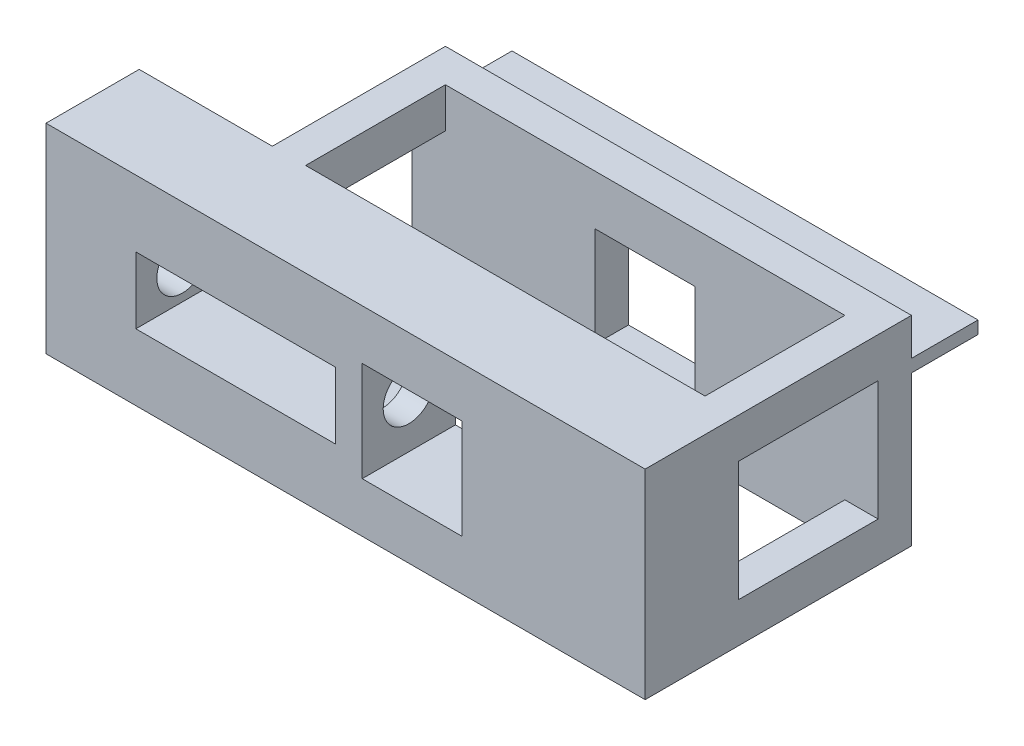
ISO-10303-21;
HEADER;
FILE_DESCRIPTION(('STEP AP214'),'2;1');
FILE_NAME('part.step','',(''),(''),'','','');
FILE_SCHEMA(('AUTOMOTIVE_DESIGN { 1 0 10303 214 1 1 1 1 }'));
ENDSEC;
DATA;
#1=APPLICATION_CONTEXT('core data for automotive mechanical design processes');
#2=APPLICATION_PROTOCOL_DEFINITION('international standard','automotive_design',2000,#1);
#3=PRODUCT_CONTEXT('',#1,'mechanical');
#4=PRODUCT('Part','Part','',(#3));
#5=PRODUCT_RELATED_PRODUCT_CATEGORY('part','',(#4));
#6=PRODUCT_DEFINITION_FORMATION('','',#4);
#7=PRODUCT_DEFINITION_CONTEXT('part definition',#1,'design');
#8=PRODUCT_DEFINITION('design','',#6,#7);
#9=PRODUCT_DEFINITION_SHAPE('','',#8);
#10=(LENGTH_UNIT() NAMED_UNIT(*) SI_UNIT(.MILLI.,.METRE.));
#11=(NAMED_UNIT(*) PLANE_ANGLE_UNIT() SI_UNIT($,.RADIAN.));
#12=(NAMED_UNIT(*) SI_UNIT($,.STERADIAN.) SOLID_ANGLE_UNIT());
#13=UNCERTAINTY_MEASURE_WITH_UNIT(LENGTH_MEASURE(1.E-05),#10,'distance_accuracy_value','');
#14=(GEOMETRIC_REPRESENTATION_CONTEXT(3) GLOBAL_UNCERTAINTY_ASSIGNED_CONTEXT((#13)) GLOBAL_UNIT_ASSIGNED_CONTEXT((#10,
#11,#12)) REPRESENTATION_CONTEXT('',''));
#15=CARTESIAN_POINT('',(0.,0.,0.));
#16=DIRECTION('',(0.,0.,1.));
#17=DIRECTION('',(1.,0.,0.));
#18=AXIS2_PLACEMENT_3D('',#15,#16,#17);
#19=CARTESIAN_POINT('',(0.,0.,-50.8));
#20=DIRECTION('',(0.,0.,1.));
#21=DIRECTION('',(1.,0.,0.));
#22=AXIS2_PLACEMENT_3D('',#19,#20,#21);
#23=PLANE('',#22);
#24=DIRECTION('',(1.,0.,0.));
#25=VECTOR('',#24,1.);
#26=CARTESIAN_POINT('',(88.9,30.988,-50.8));
#27=LINE('',#26,#25);
#28=CARTESIAN_POINT('',(0.,30.988,-50.8));
#29=VERTEX_POINT('',#28);
#30=CARTESIAN_POINT('',(88.9,30.988,-50.8));
#31=VERTEX_POINT('',#30);
#32=EDGE_CURVE('E56',#29,#31,#27,.T.);
#33=ORIENTED_EDGE('',*,*,#32,.F.);
#34=DIRECTION('',(0.,1.,0.));
#35=VECTOR('',#34,1.);
#36=CARTESIAN_POINT('',(0.,0.,-50.8));
#37=LINE('',#36,#35);
#38=CARTESIAN_POINT('',(0.,38.1,-50.8));
#39=VERTEX_POINT('',#38);
#40=EDGE_CURVE('E517',#29,#39,#37,.T.);
#41=ORIENTED_EDGE('',*,*,#40,.T.);
#42=DIRECTION('',(-1.,0.,0.));
#43=VECTOR('',#42,1.);
#44=CARTESIAN_POINT('',(0.,38.1,-50.8));
#45=LINE('',#44,#43);
#46=CARTESIAN_POINT('',(88.9,38.1,-50.8));
#47=VERTEX_POINT('',#46);
#48=EDGE_CURVE('E514',#47,#39,#45,.T.);
#49=ORIENTED_EDGE('',*,*,#48,.F.);
#50=DIRECTION('',(0.,1.,0.));
#51=VECTOR('',#50,1.);
#52=CARTESIAN_POINT('',(88.9,1.07938349616335E-13,-50.8));
#53=LINE('',#52,#51);
#54=EDGE_CURVE('E61',#31,#47,#53,.T.);
#55=ORIENTED_EDGE('',*,*,#54,.F.);
#56=EDGE_LOOP('',(#33,#41,#49,#55));
#57=FACE_BOUND('',#56,.T.);
#58=ADVANCED_FACE('F39',(#57),#23,.F.);
#59=DIRECTION('',(-1.,0.,0.));
#60=VECTOR('',#59,1.);
#61=CARTESIAN_POINT('',(88.9,28.575,-50.8));
#62=LINE('',#61,#60);
#63=CARTESIAN_POINT('',(88.9,28.575,-50.8));
#64=VERTEX_POINT('',#63);
#65=CARTESIAN_POINT('',(53.975,28.575,-50.8));
#66=VERTEX_POINT('',#65);
#67=EDGE_CURVE('E49',#64,#66,#62,.T.);
#68=ORIENTED_EDGE('',*,*,#67,.F.);
#69=CARTESIAN_POINT('',(88.9,0.,-50.8));
#70=VERTEX_POINT('',#69);
#71=EDGE_CURVE('E286',#70,#64,#53,.T.);
#72=ORIENTED_EDGE('',*,*,#71,.F.);
#73=DIRECTION('',(1.,0.,0.));
#74=VECTOR('',#73,1.);
#75=CARTESIAN_POINT('',(0.,0.,-50.8));
#76=LINE('',#75,#74);
#77=CARTESIAN_POINT('',(0.,0.,-50.8));
#78=VERTEX_POINT('',#77);
#79=EDGE_CURVE('E520',#78,#70,#76,.T.);
#80=ORIENTED_EDGE('',*,*,#79,.F.);
#81=CARTESIAN_POINT('',(0.,28.575,-50.8));
#82=VERTEX_POINT('',#81);
#83=EDGE_CURVE('E518',#78,#82,#37,.T.);
#84=ORIENTED_EDGE('',*,*,#83,.T.);
#85=CARTESIAN_POINT('',(34.925,28.575,-50.8));
#86=VERTEX_POINT('',#85);
#87=EDGE_CURVE('E11',#86,#82,#62,.T.);
#88=ORIENTED_EDGE('',*,*,#87,.F.);
#89=DIRECTION('',(0.,-1.,0.));
#90=VECTOR('',#89,1.);
#91=CARTESIAN_POINT('',(34.925,0.,-50.8));
#92=LINE('',#91,#90);
#93=CARTESIAN_POINT('',(34.925,9.525,-50.8));
#94=VERTEX_POINT('',#93);
#95=EDGE_CURVE('E459',#86,#94,#92,.T.);
#96=ORIENTED_EDGE('',*,*,#95,.T.);
#97=DIRECTION('',(1.,0.,0.));
#98=VECTOR('',#97,1.);
#99=CARTESIAN_POINT('',(0.,9.52500000000001,-50.8));
#100=LINE('',#99,#98);
#101=CARTESIAN_POINT('',(53.975,9.525,-50.8));
#102=VERTEX_POINT('',#101);
#103=EDGE_CURVE('E511',#94,#102,#100,.T.);
#104=ORIENTED_EDGE('',*,*,#103,.T.);
#105=DIRECTION('',(0.,1.,0.));
#106=VECTOR('',#105,1.);
#107=CARTESIAN_POINT('',(53.975,0.,-50.8));
#108=LINE('',#107,#106);
#109=EDGE_CURVE('E508',#102,#66,#108,.T.);
#110=ORIENTED_EDGE('',*,*,#109,.T.);
#111=EDGE_LOOP('',(#68,#72,#80,#84,#88,#96,#104,#110));
#112=FACE_BOUND('',#111,.T.);
#113=ADVANCED_FACE('F535',(#112),#23,.F.);
#114=CARTESIAN_POINT('',(0.,0.,-44.45));
#115=DIRECTION('',(-1.,0.,0.));
#116=DIRECTION('',(0.,-1.,0.));
#117=AXIS2_PLACEMENT_3D('',#114,#115,#116);
#118=PLANE('',#117);
#119=DIRECTION('',(0.,0.,1.));
#120=VECTOR('',#119,1.);
#121=CARTESIAN_POINT('',(0.,30.48,-60.7190170884015));
#122=LINE('',#121,#120);
#123=CARTESIAN_POINT('',(0.,30.48,-44.45));
#124=VERTEX_POINT('',#123);
#125=CARTESIAN_POINT('',(0.,30.48,-17.78));
#126=VERTEX_POINT('',#125);
#127=EDGE_CURVE('E463',#124,#126,#122,.T.);
#128=ORIENTED_EDGE('',*,*,#127,.T.);
#129=DIRECTION('',(0.,-1.,0.));
#130=VECTOR('',#129,1.);
#131=CARTESIAN_POINT('',(0.,0.,-17.78));
#132=LINE('',#131,#130);
#133=CARTESIAN_POINT('',(0.,38.1,-17.78));
#134=VERTEX_POINT('',#133);
#135=EDGE_CURVE('E420',#134,#126,#132,.T.);
#136=ORIENTED_EDGE('',*,*,#135,.F.);
#137=DIRECTION('',(0.,0.,1.));
#138=VECTOR('',#137,1.);
#139=CARTESIAN_POINT('',(0.,38.1,-60.7190170884015));
#140=LINE('',#139,#138);
#141=EDGE_CURVE('E456',#39,#134,#140,.T.);
#142=ORIENTED_EDGE('',*,*,#141,.F.);
#143=ORIENTED_EDGE('',*,*,#40,.F.);
#144=DIRECTION('',(0.,0.,1.));
#145=VECTOR('',#144,1.);
#146=CARTESIAN_POINT('',(0.,30.988,-63.5));
#147=LINE('',#146,#145);
#148=CARTESIAN_POINT('',(0.,30.988,-63.5));
#149=VERTEX_POINT('',#148);
#150=EDGE_CURVE('E292',#149,#29,#147,.T.);
#151=ORIENTED_EDGE('',*,*,#150,.F.);
#152=DIRECTION('',(0.,1.,0.));
#153=VECTOR('',#152,1.);
#154=CARTESIAN_POINT('',(0.,30.988,-63.5));
#155=LINE('',#154,#153);
#156=CARTESIAN_POINT('',(0.,28.575,-63.5));
#157=VERTEX_POINT('',#156);
#158=EDGE_CURVE('E271',#157,#149,#155,.T.);
#159=ORIENTED_EDGE('',*,*,#158,.F.);
#160=DIRECTION('',(0.,0.,1.));
#161=VECTOR('',#160,1.);
#162=CARTESIAN_POINT('',(0.,28.575,-63.5));
#163=LINE('',#162,#161);
#164=EDGE_CURVE('E268',#157,#82,#163,.T.);
#165=ORIENTED_EDGE('',*,*,#164,.T.);
#166=ORIENTED_EDGE('',*,*,#83,.F.);
#167=DIRECTION('',(0.,0.,1.));
#168=VECTOR('',#167,1.);
#169=CARTESIAN_POINT('',(0.,0.,-60.7190170884015));
#170=LINE('',#169,#168);
#171=CARTESIAN_POINT('',(0.,0.,-17.78));
#172=VERTEX_POINT('',#171);
#173=EDGE_CURVE('E296',#78,#172,#170,.T.);
#174=ORIENTED_EDGE('',*,*,#173,.T.);
#175=DIRECTION('',(0.,1.,0.));
#176=VECTOR('',#175,1.);
#177=CARTESIAN_POINT('',(0.,0.,-17.78));
#178=LINE('',#177,#176);
#179=CARTESIAN_POINT('',(0.,7.62000000000001,-17.78));
#180=VERTEX_POINT('',#179);
#181=EDGE_CURVE('E417',#172,#180,#178,.T.);
#182=ORIENTED_EDGE('',*,*,#181,.T.);
#183=DIRECTION('',(0.,0.,1.));
#184=VECTOR('',#183,1.);
#185=CARTESIAN_POINT('',(0.,7.62000000000001,-60.7190170884015));
#186=LINE('',#185,#184);
#187=CARTESIAN_POINT('',(0.,7.62000000000001,-44.45));
#188=VERTEX_POINT('',#187);
#189=EDGE_CURVE('E287',#188,#180,#186,.T.);
#190=ORIENTED_EDGE('',*,*,#189,.F.);
#191=DIRECTION('',(0.,1.,0.));
#192=VECTOR('',#191,1.);
#193=CARTESIAN_POINT('',(0.,0.,-44.45));
#194=LINE('',#193,#192);
#195=EDGE_CURVE('E490',#188,#124,#194,.T.);
#196=ORIENTED_EDGE('',*,*,#195,.T.);
#197=EDGE_LOOP('',(#128,#136,#142,#143,#151,#159,#165,#166,#174,#182,#190,#196));
#198=FACE_BOUND('',#197,.T.);
#199=ADVANCED_FACE('F551',(#198),#118,.T.);
#200=CARTESIAN_POINT('',(0.,30.48,-60.7190170884015));
#201=DIRECTION('',(0.,1.,0.));
#202=DIRECTION('',(0.,0.,1.));
#203=AXIS2_PLACEMENT_3D('',#200,#201,#202);
#204=PLANE('',#203);
#205=DIRECTION('',(1.,0.,0.));
#206=VECTOR('',#205,1.);
#207=CARTESIAN_POINT('',(0.,30.48,-17.78));
#208=LINE('',#207,#206);
#209=CARTESIAN_POINT('',(6.34999999999999,30.48,-17.78));
#210=VERTEX_POINT('',#209);
#211=EDGE_CURVE('E423',#126,#210,#208,.T.);
#212=ORIENTED_EDGE('',*,*,#211,.F.);
#213=ORIENTED_EDGE('',*,*,#127,.F.);
#214=DIRECTION('',(-1.,0.,0.));
#215=VECTOR('',#214,1.);
#216=CARTESIAN_POINT('',(0.,30.48,-44.45));
#217=LINE('',#216,#215);
#218=CARTESIAN_POINT('',(6.34999999999999,30.48,-44.45));
#219=VERTEX_POINT('',#218);
#220=EDGE_CURVE('E488',#219,#124,#217,.T.);
#221=ORIENTED_EDGE('',*,*,#220,.F.);
#222=DIRECTION('',(0.,0.,1.));
#223=VECTOR('',#222,1.);
#224=CARTESIAN_POINT('',(6.34999999999999,30.48,-60.7190170884015));
#225=LINE('',#224,#223);
#226=EDGE_CURVE('E460',#219,#210,#225,.T.);
#227=ORIENTED_EDGE('',*,*,#226,.T.);
#228=EDGE_LOOP('',(#212,#213,#221,#227));
#229=FACE_BOUND('',#228,.T.);
#230=ADVANCED_FACE('F613',(#229),#204,.F.);
#231=CARTESIAN_POINT('',(6.35,0.,-60.7190170884015));
#232=DIRECTION('',(-1.,0.,0.));
#233=DIRECTION('',(0.,-1.,0.));
#234=AXIS2_PLACEMENT_3D('',#231,#232,#233);
#235=PLANE('',#234);
#236=DIRECTION('',(0.,-1.,0.));
#237=VECTOR('',#236,1.);
#238=CARTESIAN_POINT('',(6.35,0.,-17.78));
#239=LINE('',#238,#237);
#240=CARTESIAN_POINT('',(6.34999999999999,38.1,-17.78));
#241=VERTEX_POINT('',#240);
#242=EDGE_CURVE('E426',#241,#210,#239,.T.);
#243=ORIENTED_EDGE('',*,*,#242,.T.);
#244=ORIENTED_EDGE('',*,*,#226,.F.);
#245=DIRECTION('',(0.,-1.,0.));
#246=VECTOR('',#245,1.);
#247=CARTESIAN_POINT('',(6.35,0.,-44.45));
#248=LINE('',#247,#246);
#249=CARTESIAN_POINT('',(6.34999999999999,38.1,-44.45));
#250=VERTEX_POINT('',#249);
#251=EDGE_CURVE('E486',#250,#219,#248,.T.);
#252=ORIENTED_EDGE('',*,*,#251,.F.);
#253=DIRECTION('',(0.,0.,1.));
#254=VECTOR('',#253,1.);
#255=CARTESIAN_POINT('',(6.34999999999999,38.1,-60.7190170884015));
#256=LINE('',#255,#254);
#257=EDGE_CURVE('E457',#250,#241,#256,.T.);
#258=ORIENTED_EDGE('',*,*,#257,.T.);
#259=EDGE_LOOP('',(#243,#244,#252,#258));
#260=FACE_BOUND('',#259,.T.);
#261=ADVANCED_FACE('F610',(#260),#235,.F.);
#262=CARTESIAN_POINT('',(0.,38.1,-44.45));
#263=DIRECTION('',(0.,-1.,0.));
#264=DIRECTION('',(0.,0.,-1.));
#265=AXIS2_PLACEMENT_3D('',#262,#263,#264);
#266=PLANE('',#265);
#267=DIRECTION('',(0.,0.,1.));
#268=VECTOR('',#267,1.);
#269=CARTESIAN_POINT('',(88.9,38.1,-60.7190170884015));
#270=LINE('',#269,#268);
#271=CARTESIAN_POINT('',(88.9,38.1,0.));
#272=VERTEX_POINT('',#271);
#273=EDGE_CURVE('E317',#47,#272,#270,.T.);
#274=ORIENTED_EDGE('',*,*,#273,.F.);
#275=ORIENTED_EDGE('',*,*,#48,.T.);
#276=ORIENTED_EDGE('',*,*,#141,.T.);
#277=DIRECTION('',(1.,0.,0.));
#278=VECTOR('',#277,1.);
#279=CARTESIAN_POINT('',(0.,38.1,-17.78));
#280=LINE('',#279,#278);
#281=CARTESIAN_POINT('',(-25.4,38.1,-17.78));
#282=VERTEX_POINT('',#281);
#283=EDGE_CURVE('E437',#282,#134,#280,.T.);
#284=ORIENTED_EDGE('',*,*,#283,.F.);
#285=DIRECTION('',(0.,0.,1.));
#286=VECTOR('',#285,1.);
#287=CARTESIAN_POINT('',(-25.4,38.1,-17.78));
#288=LINE('',#287,#286);
#289=CARTESIAN_POINT('',(-25.4,38.1,0.));
#290=VERTEX_POINT('',#289);
#291=EDGE_CURVE('E442',#282,#290,#288,.T.);
#292=ORIENTED_EDGE('',*,*,#291,.T.);
#293=DIRECTION('',(1.,0.,0.));
#294=VECTOR('',#293,1.);
#295=CARTESIAN_POINT('',(0.,38.1,0.));
#296=LINE('',#295,#294);
#297=EDGE_CURVE('E451',#290,#272,#296,.T.);
#298=ORIENTED_EDGE('',*,*,#297,.T.);
#299=EDGE_LOOP('',(#274,#275,#276,#284,#292,#298));
#300=FACE_BOUND('',#299,.T.);
#301=DIRECTION('',(-1.,0.,0.));
#302=VECTOR('',#301,1.);
#303=CARTESIAN_POINT('',(0.,38.1,-44.45));
#304=LINE('',#303,#302);
#305=CARTESIAN_POINT('',(82.55,38.1,-44.45));
#306=VERTEX_POINT('',#305);
#307=EDGE_CURVE('E484',#306,#250,#304,.T.);
#308=ORIENTED_EDGE('',*,*,#307,.F.);
#309=DIRECTION('',(0.,0.,1.));
#310=VECTOR('',#309,1.);
#311=CARTESIAN_POINT('',(82.55,38.1,-60.7190170884015));
#312=LINE('',#311,#310);
#313=CARTESIAN_POINT('',(82.55,38.1,-17.78));
#314=VERTEX_POINT('',#313);
#315=EDGE_CURVE('E321',#306,#314,#312,.T.);
#316=ORIENTED_EDGE('',*,*,#315,.T.);
#317=EDGE_CURVE('E436',#241,#314,#280,.T.);
#318=ORIENTED_EDGE('',*,*,#317,.F.);
#319=ORIENTED_EDGE('',*,*,#257,.F.);
#320=EDGE_LOOP('',(#308,#316,#318,#319));
#321=FACE_BOUND('',#320,.T.);
#322=ADVANCED_FACE('F555',(#300,#321),#266,.F.);
#323=CARTESIAN_POINT('',(0.,0.,-44.45));
#324=DIRECTION('',(0.,1.,0.));
#325=DIRECTION('',(0.,0.,1.));
#326=AXIS2_PLACEMENT_3D('',#323,#324,#325);
#327=PLANE('',#326);
#328=ORIENTED_EDGE('',*,*,#173,.F.);
#329=ORIENTED_EDGE('',*,*,#79,.T.);
#330=DIRECTION('',(0.,0.,1.));
#331=VECTOR('',#330,1.);
#332=CARTESIAN_POINT('',(88.9,0.,-60.7190170884015));
#333=LINE('',#332,#331);
#334=CARTESIAN_POINT('',(88.9,0.,0.));
#335=VERTEX_POINT('',#334);
#336=EDGE_CURVE('E299',#70,#335,#333,.T.);
#337=ORIENTED_EDGE('',*,*,#336,.T.);
#338=DIRECTION('',(1.,0.,0.));
#339=VECTOR('',#338,1.);
#340=CARTESIAN_POINT('',(0.,0.,0.));
#341=LINE('',#340,#339);
#342=CARTESIAN_POINT('',(-25.4,0.,0.));
#343=VERTEX_POINT('',#342);
#344=EDGE_CURVE('E428',#343,#335,#341,.T.);
#345=ORIENTED_EDGE('',*,*,#344,.F.);
#346=DIRECTION('',(0.,0.,1.));
#347=VECTOR('',#346,1.);
#348=CARTESIAN_POINT('',(-25.4,0.,-17.78));
#349=LINE('',#348,#347);
#350=CARTESIAN_POINT('',(-25.4,0.,-17.78));
#351=VERTEX_POINT('',#350);
#352=EDGE_CURVE('E449',#351,#343,#349,.T.);
#353=ORIENTED_EDGE('',*,*,#352,.F.);
#354=DIRECTION('',(1.,0.,0.));
#355=VECTOR('',#354,1.);
#356=CARTESIAN_POINT('',(0.,0.,-17.78));
#357=LINE('',#356,#355);
#358=EDGE_CURVE('E429',#351,#172,#357,.T.);
#359=ORIENTED_EDGE('',*,*,#358,.T.);
#360=EDGE_LOOP('',(#328,#329,#337,#345,#353,#359));
#361=FACE_BOUND('',#360,.T.);
#362=DIRECTION('',(1.,0.,0.));
#363=VECTOR('',#362,1.);
#364=CARTESIAN_POINT('',(0.,0.,-44.45));
#365=LINE('',#364,#363);
#366=CARTESIAN_POINT('',(6.34999999999999,0.,-44.45));
#367=VERTEX_POINT('',#366);
#368=CARTESIAN_POINT('',(82.55,0.,-44.45));
#369=VERTEX_POINT('',#368);
#370=EDGE_CURVE('E497',#367,#369,#365,.T.);
#371=ORIENTED_EDGE('',*,*,#370,.F.);
#372=DIRECTION('',(0.,0.,1.));
#373=VECTOR('',#372,1.);
#374=CARTESIAN_POINT('',(6.34999999999999,0.,-60.7190170884015));
#375=LINE('',#374,#373);
#376=CARTESIAN_POINT('',(6.34999999999999,0.,-17.78));
#377=VERTEX_POINT('',#376);
#378=EDGE_CURVE('E300',#367,#377,#375,.T.);
#379=ORIENTED_EDGE('',*,*,#378,.T.);
#380=CARTESIAN_POINT('',(82.55,0.,-17.78));
#381=VERTEX_POINT('',#380);
#382=EDGE_CURVE('E433',#377,#381,#357,.T.);
#383=ORIENTED_EDGE('',*,*,#382,.T.);
#384=DIRECTION('',(0.,0.,1.));
#385=VECTOR('',#384,1.);
#386=CARTESIAN_POINT('',(82.55,0.,-60.7190170884015));
#387=LINE('',#386,#385);
#388=EDGE_CURVE('E312',#369,#381,#387,.T.);
#389=ORIENTED_EDGE('',*,*,#388,.F.);
#390=EDGE_LOOP('',(#371,#379,#383,#389));
#391=FACE_BOUND('',#390,.T.);
#392=ADVANCED_FACE('F563',(#361,#391),#327,.F.);
#393=CARTESIAN_POINT('',(34.925,0.,-44.45));
#394=DIRECTION('',(1.,0.,0.));
#395=DIRECTION('',(0.,0.,-1.));
#396=AXIS2_PLACEMENT_3D('',#393,#394,#395);
#397=PLANE('',#396);
#398=ORIENTED_EDGE('',*,*,#95,.F.);
#399=DIRECTION('',(0.,0.,-1.));
#400=VECTOR('',#399,1.);
#401=CARTESIAN_POINT('',(34.925,28.575,-44.45));
#402=LINE('',#401,#400);
#403=CARTESIAN_POINT('',(34.925,28.575,-44.45));
#404=VERTEX_POINT('',#403);
#405=EDGE_CURVE('E43',#404,#86,#402,.T.);
#406=ORIENTED_EDGE('',*,*,#405,.F.);
#407=DIRECTION('',(0.,-1.,0.));
#408=VECTOR('',#407,1.);
#409=CARTESIAN_POINT('',(34.925,0.,-44.45));
#410=LINE('',#409,#408);
#411=CARTESIAN_POINT('',(34.925,9.525,-44.45));
#412=VERTEX_POINT('',#411);
#413=EDGE_CURVE('E468',#404,#412,#410,.T.);
#414=ORIENTED_EDGE('',*,*,#413,.T.);
#415=DIRECTION('',(0.,0.,-1.));
#416=VECTOR('',#415,1.);
#417=CARTESIAN_POINT('',(34.925,9.525,-44.45));
#418=LINE('',#417,#416);
#419=EDGE_CURVE('E505',#412,#94,#418,.T.);
#420=ORIENTED_EDGE('',*,*,#419,.T.);
#421=EDGE_LOOP('',(#398,#406,#414,#420));
#422=FACE_BOUND('',#421,.T.);
#423=ADVANCED_FACE('F41',(#422),#397,.T.);
#424=CARTESIAN_POINT('',(0.,28.575,-44.45));
#425=DIRECTION('',(0.,-1.,0.));
#426=DIRECTION('',(1.,0.,0.));
#427=AXIS2_PLACEMENT_3D('',#424,#425,#426);
#428=PLANE('',#427);
#429=ORIENTED_EDGE('',*,*,#405,.T.);
#430=ORIENTED_EDGE('',*,*,#87,.T.);
#431=ORIENTED_EDGE('',*,*,#164,.F.);
#432=DIRECTION('',(-1.,0.,0.));
#433=VECTOR('',#432,1.);
#434=CARTESIAN_POINT('',(88.9,28.575,-63.5));
#435=LINE('',#434,#433);
#436=CARTESIAN_POINT('',(88.9,28.575,-63.5));
#437=VERTEX_POINT('',#436);
#438=EDGE_CURVE('E260',#437,#157,#435,.T.);
#439=ORIENTED_EDGE('',*,*,#438,.F.);
#440=DIRECTION('',(0.,0.,1.));
#441=VECTOR('',#440,1.);
#442=CARTESIAN_POINT('',(88.9,28.575,-63.5));
#443=LINE('',#442,#441);
#444=EDGE_CURVE('E266',#437,#64,#443,.T.);
#445=ORIENTED_EDGE('',*,*,#444,.T.);
#446=ORIENTED_EDGE('',*,*,#67,.T.);
#447=DIRECTION('',(0.,0.,-1.));
#448=VECTOR('',#447,1.);
#449=CARTESIAN_POINT('',(53.975,28.575,-44.45));
#450=LINE('',#449,#448);
#451=CARTESIAN_POINT('',(53.975,28.575,-44.45));
#452=VERTEX_POINT('',#451);
#453=EDGE_CURVE('E526',#452,#66,#450,.T.);
#454=ORIENTED_EDGE('',*,*,#453,.F.);
#455=DIRECTION('',(-1.,0.,0.));
#456=VECTOR('',#455,1.);
#457=CARTESIAN_POINT('',(0.,28.575,-44.45));
#458=LINE('',#457,#456);
#459=EDGE_CURVE('E471',#452,#404,#458,.T.);
#460=ORIENTED_EDGE('',*,*,#459,.T.);
#461=EDGE_LOOP('',(#429,#430,#431,#439,#445,#446,#454,#460));
#462=FACE_BOUND('',#461,.T.);
#463=ADVANCED_FACE('F263',(#462),#428,.T.);
#464=CARTESIAN_POINT('',(53.975,0.,-44.45));
#465=DIRECTION('',(-1.,0.,0.));
#466=DIRECTION('',(0.,0.,1.));
#467=AXIS2_PLACEMENT_3D('',#464,#465,#466);
#468=PLANE('',#467);
#469=ORIENTED_EDGE('',*,*,#109,.F.);
#470=DIRECTION('',(0.,0.,-1.));
#471=VECTOR('',#470,1.);
#472=CARTESIAN_POINT('',(53.975,9.525,-44.45));
#473=LINE('',#472,#471);
#474=CARTESIAN_POINT('',(53.975,9.525,-44.45));
#475=VERTEX_POINT('',#474);
#476=EDGE_CURVE('E525',#475,#102,#473,.T.);
#477=ORIENTED_EDGE('',*,*,#476,.F.);
#478=DIRECTION('',(0.,1.,0.));
#479=VECTOR('',#478,1.);
#480=CARTESIAN_POINT('',(53.975,0.,-44.45));
#481=LINE('',#480,#479);
#482=EDGE_CURVE('E474',#475,#452,#481,.T.);
#483=ORIENTED_EDGE('',*,*,#482,.T.);
#484=ORIENTED_EDGE('',*,*,#453,.T.);
#485=EDGE_LOOP('',(#469,#477,#483,#484));
#486=FACE_BOUND('',#485,.T.);
#487=ADVANCED_FACE('F540',(#486),#468,.T.);
#488=CARTESIAN_POINT('',(0.,9.52500000000001,-44.45));
#489=DIRECTION('',(0.,1.,0.));
#490=DIRECTION('',(-1.,0.,0.));
#491=AXIS2_PLACEMENT_3D('',#488,#489,#490);
#492=PLANE('',#491);
#493=ORIENTED_EDGE('',*,*,#103,.F.);
#494=ORIENTED_EDGE('',*,*,#419,.F.);
#495=DIRECTION('',(1.,0.,0.));
#496=VECTOR('',#495,1.);
#497=CARTESIAN_POINT('',(0.,9.52500000000001,-44.45));
#498=LINE('',#497,#496);
#499=EDGE_CURVE('E477',#412,#475,#498,.T.);
#500=ORIENTED_EDGE('',*,*,#499,.T.);
#501=ORIENTED_EDGE('',*,*,#476,.T.);
#502=EDGE_LOOP('',(#493,#494,#500,#501));
#503=FACE_BOUND('',#502,.T.);
#504=ADVANCED_FACE('F537',(#503),#492,.T.);
#505=CARTESIAN_POINT('',(88.9,1.07938349616335E-13,-44.45));
#506=DIRECTION('',(-1.,0.,0.));
#507=DIRECTION('',(0.,-1.,0.));
#508=AXIS2_PLACEMENT_3D('',#505,#506,#507);
#509=PLANE('',#508);
#510=ORIENTED_EDGE('',*,*,#336,.F.);
#511=ORIENTED_EDGE('',*,*,#71,.T.);
#512=ORIENTED_EDGE('',*,*,#444,.F.);
#513=DIRECTION('',(0.,-1.,0.));
#514=VECTOR('',#513,1.);
#515=CARTESIAN_POINT('',(88.9,30.988,-63.5));
#516=LINE('',#515,#514);
#517=CARTESIAN_POINT('',(88.9,30.988,-63.5));
#518=VERTEX_POINT('',#517);
#519=EDGE_CURVE('E272',#518,#437,#516,.T.);
#520=ORIENTED_EDGE('',*,*,#519,.F.);
#521=DIRECTION('',(0.,0.,1.));
#522=VECTOR('',#521,1.);
#523=CARTESIAN_POINT('',(88.9,30.988,-63.5));
#524=LINE('',#523,#522);
#525=EDGE_CURVE('E545',#518,#31,#524,.T.);
#526=ORIENTED_EDGE('',*,*,#525,.T.);
#527=ORIENTED_EDGE('',*,*,#54,.T.);
#528=ORIENTED_EDGE('',*,*,#273,.T.);
#529=DIRECTION('',(0.,1.,0.));
#530=VECTOR('',#529,1.);
#531=CARTESIAN_POINT('',(88.9,0.,0.));
#532=LINE('',#531,#530);
#533=EDGE_CURVE('E444',#335,#272,#532,.T.);
#534=ORIENTED_EDGE('',*,*,#533,.F.);
#535=EDGE_LOOP('',(#510,#511,#512,#520,#526,#527,#528,#534));
#536=FACE_BOUND('',#535,.T.);
#537=DIRECTION('',(0.,1.,0.));
#538=VECTOR('',#537,1.);
#539=CARTESIAN_POINT('',(88.9,1.07938349616335E-13,-44.45));
#540=LINE('',#539,#538);
#541=CARTESIAN_POINT('',(88.9,7.62000000000001,-44.45));
#542=VERTEX_POINT('',#541);
#543=CARTESIAN_POINT('',(88.9,30.48,-44.45));
#544=VERTEX_POINT('',#543);
#545=EDGE_CURVE('E503',#542,#544,#540,.T.);
#546=ORIENTED_EDGE('',*,*,#545,.F.);
#547=DIRECTION('',(0.,0.,1.));
#548=VECTOR('',#547,1.);
#549=CARTESIAN_POINT('',(88.9,7.62000000000001,-60.7190170884015));
#550=LINE('',#549,#548);
#551=CARTESIAN_POINT('',(88.9,7.62000000000001,-17.78));
#552=VERTEX_POINT('',#551);
#553=EDGE_CURVE('E305',#542,#552,#550,.T.);
#554=ORIENTED_EDGE('',*,*,#553,.T.);
#555=DIRECTION('',(0.,1.,0.));
#556=VECTOR('',#555,1.);
#557=CARTESIAN_POINT('',(88.9,0.,-17.78));
#558=LINE('',#557,#556);
#559=CARTESIAN_POINT('',(88.9,30.48,-17.78));
#560=VERTEX_POINT('',#559);
#561=EDGE_CURVE('E432',#552,#560,#558,.T.);
#562=ORIENTED_EDGE('',*,*,#561,.T.);
#563=DIRECTION('',(0.,0.,1.));
#564=VECTOR('',#563,1.);
#565=CARTESIAN_POINT('',(88.9,30.48,-60.7190170884015));
#566=LINE('',#565,#564);
#567=EDGE_CURVE('E308',#544,#560,#566,.T.);
#568=ORIENTED_EDGE('',*,*,#567,.F.);
#569=EDGE_LOOP('',(#546,#554,#562,#568));
#570=FACE_BOUND('',#569,.T.);
#571=ADVANCED_FACE('F284',(#536,#570),#509,.F.);
#572=CARTESIAN_POINT('',(0.,0.,-44.45));
#573=DIRECTION('',(0.,0.,1.));
#574=DIRECTION('',(1.,0.,0.));
#575=AXIS2_PLACEMENT_3D('',#572,#573,#574);
#576=PLANE('',#575);
#577=ORIENTED_EDGE('',*,*,#413,.F.);
#578=ORIENTED_EDGE('',*,*,#459,.F.);
#579=ORIENTED_EDGE('',*,*,#482,.F.);
#580=ORIENTED_EDGE('',*,*,#499,.F.);
#581=EDGE_LOOP('',(#577,#578,#579,#580));
#582=FACE_BOUND('',#581,.T.);
#583=DIRECTION('',(-1.,0.,0.));
#584=VECTOR('',#583,1.);
#585=CARTESIAN_POINT('',(0.,30.48,-44.45));
#586=LINE('',#585,#584);
#587=CARTESIAN_POINT('',(82.55,30.48,-44.45));
#588=VERTEX_POINT('',#587);
#589=EDGE_CURVE('E480',#544,#588,#586,.T.);
#590=ORIENTED_EDGE('',*,*,#589,.T.);
#591=DIRECTION('',(0.,1.,0.));
#592=VECTOR('',#591,1.);
#593=CARTESIAN_POINT('',(82.55,0.,-44.45));
#594=LINE('',#593,#592);
#595=EDGE_CURVE('E482',#588,#306,#594,.T.);
#596=ORIENTED_EDGE('',*,*,#595,.T.);
#597=ORIENTED_EDGE('',*,*,#307,.T.);
#598=ORIENTED_EDGE('',*,*,#251,.T.);
#599=ORIENTED_EDGE('',*,*,#220,.T.);
#600=ORIENTED_EDGE('',*,*,#195,.F.);
#601=DIRECTION('',(1.,0.,0.));
#602=VECTOR('',#601,1.);
#603=CARTESIAN_POINT('',(0.,7.62000000000001,-44.45));
#604=LINE('',#603,#602);
#605=CARTESIAN_POINT('',(6.34999999999999,7.62000000000001,-44.45));
#606=VERTEX_POINT('',#605);
#607=EDGE_CURVE('E493',#188,#606,#604,.T.);
#608=ORIENTED_EDGE('',*,*,#607,.T.);
#609=DIRECTION('',(0.,-1.,0.));
#610=VECTOR('',#609,1.);
#611=CARTESIAN_POINT('',(6.34999999999999,0.,-44.45));
#612=LINE('',#611,#610);
#613=EDGE_CURVE('E495',#606,#367,#612,.T.);
#614=ORIENTED_EDGE('',*,*,#613,.T.);
#615=ORIENTED_EDGE('',*,*,#370,.T.);
#616=DIRECTION('',(0.,1.,0.));
#617=VECTOR('',#616,1.);
#618=CARTESIAN_POINT('',(82.55,0.,-44.45));
#619=LINE('',#618,#617);
#620=CARTESIAN_POINT('',(82.55,7.62000000000001,-44.45));
#621=VERTEX_POINT('',#620);
#622=EDGE_CURVE('E499',#369,#621,#619,.T.);
#623=ORIENTED_EDGE('',*,*,#622,.T.);
#624=DIRECTION('',(1.,0.,0.));
#625=VECTOR('',#624,1.);
#626=CARTESIAN_POINT('',(0.,7.62000000000001,-44.45));
#627=LINE('',#626,#625);
#628=EDGE_CURVE('E501',#621,#542,#627,.T.);
#629=ORIENTED_EDGE('',*,*,#628,.T.);
#630=ORIENTED_EDGE('',*,*,#545,.T.);
#631=EDGE_LOOP('',(#590,#596,#597,#598,#599,#600,#608,#614,#615,#623,#629,#630));
#632=FACE_BOUND('',#631,.T.);
#633=ADVANCED_FACE('F575',(#582,#632),#576,.T.);
#634=CARTESIAN_POINT('',(0.,0.,0.));
#635=DIRECTION('',(0.,0.,1.));
#636=DIRECTION('',(1.,0.,0.));
#637=AXIS2_PLACEMENT_3D('',#634,#635,#636);
#638=PLANE('',#637);
#639=ORIENTED_EDGE('',*,*,#297,.F.);
#640=DIRECTION('',(0.,1.,0.));
#641=VECTOR('',#640,1.);
#642=CARTESIAN_POINT('',(-25.4,0.,0.));
#643=LINE('',#642,#641);
#644=EDGE_CURVE('E446',#343,#290,#643,.T.);
#645=ORIENTED_EDGE('',*,*,#644,.F.);
#646=ORIENTED_EDGE('',*,*,#344,.T.);
#647=ORIENTED_EDGE('',*,*,#533,.T.);
#648=EDGE_LOOP('',(#639,#645,#646,#647));
#649=FACE_BOUND('',#648,.T.);
#650=DIRECTION('',(-1.,0.,0.));
#651=VECTOR('',#650,1.);
#652=CARTESIAN_POINT('',(0.,25.4,0.));
#653=LINE('',#652,#651);
#654=CARTESIAN_POINT('',(29.845,25.4,0.));
#655=VERTEX_POINT('',#654);
#656=CARTESIAN_POINT('',(-8.25500000000001,25.4,0.));
#657=VERTEX_POINT('',#656);
#658=EDGE_CURVE('E355',#655,#657,#653,.T.);
#659=ORIENTED_EDGE('',*,*,#658,.F.);
#660=DIRECTION('',(0.,-1.,0.));
#661=VECTOR('',#660,1.);
#662=CARTESIAN_POINT('',(29.845,0.,0.));
#663=LINE('',#662,#661);
#664=CARTESIAN_POINT('',(29.845,12.7,0.));
#665=VERTEX_POINT('',#664);
#666=EDGE_CURVE('E369',#655,#665,#663,.T.);
#667=ORIENTED_EDGE('',*,*,#666,.T.);
#668=DIRECTION('',(-1.,0.,0.));
#669=VECTOR('',#668,1.);
#670=CARTESIAN_POINT('',(0.,12.7,0.));
#671=LINE('',#670,#669);
#672=CARTESIAN_POINT('',(-8.25500000000001,12.7,0.));
#673=VERTEX_POINT('',#672);
#674=EDGE_CURVE('E366',#665,#673,#671,.T.);
#675=ORIENTED_EDGE('',*,*,#674,.T.);
#676=DIRECTION('',(0.,-1.,0.));
#677=VECTOR('',#676,1.);
#678=CARTESIAN_POINT('',(-8.25500000000001,0.,0.));
#679=LINE('',#678,#677);
#680=EDGE_CURVE('E363',#657,#673,#679,.T.);
#681=ORIENTED_EDGE('',*,*,#680,.F.);
#682=EDGE_LOOP('',(#659,#667,#675,#681));
#683=FACE_BOUND('',#682,.T.);
#684=DIRECTION('',(1.,0.,0.));
#685=VECTOR('',#684,1.);
#686=CARTESIAN_POINT('',(0.,28.575,0.));
#687=LINE('',#686,#685);
#688=CARTESIAN_POINT('',(34.925,28.575,0.));
#689=VERTEX_POINT('',#688);
#690=CARTESIAN_POINT('',(53.975,28.575,0.));
#691=VERTEX_POINT('',#690);
#692=EDGE_CURVE('E343',#689,#691,#687,.T.);
#693=ORIENTED_EDGE('',*,*,#692,.T.);
#694=DIRECTION('',(0.,-1.,0.));
#695=VECTOR('',#694,1.);
#696=CARTESIAN_POINT('',(53.975,0.,0.));
#697=LINE('',#696,#695);
#698=CARTESIAN_POINT('',(53.975,9.525,0.));
#699=VERTEX_POINT('',#698);
#700=EDGE_CURVE('E340',#691,#699,#697,.T.);
#701=ORIENTED_EDGE('',*,*,#700,.T.);
#702=DIRECTION('',(1.,0.,0.));
#703=VECTOR('',#702,1.);
#704=CARTESIAN_POINT('',(0.,9.52500000000001,0.));
#705=LINE('',#704,#703);
#706=CARTESIAN_POINT('',(34.925,9.525,0.));
#707=VERTEX_POINT('',#706);
#708=EDGE_CURVE('E349',#707,#699,#705,.T.);
#709=ORIENTED_EDGE('',*,*,#708,.F.);
#710=DIRECTION('',(0.,-1.,0.));
#711=VECTOR('',#710,1.);
#712=CARTESIAN_POINT('',(34.925,0.,0.));
#713=LINE('',#712,#711);
#714=EDGE_CURVE('E346',#689,#707,#713,.T.);
#715=ORIENTED_EDGE('',*,*,#714,.F.);
#716=EDGE_LOOP('',(#693,#701,#709,#715));
#717=FACE_BOUND('',#716,.T.);
#718=ADVANCED_FACE('F621',(#649,#683,#717),#638,.T.);
#719=CARTESIAN_POINT('',(0.,0.,-17.78));
#720=DIRECTION('',(0.,0.,1.));
#721=DIRECTION('',(1.,0.,0.));
#722=AXIS2_PLACEMENT_3D('',#719,#720,#721);
#723=PLANE('',#722);
#724=DIRECTION('',(0.,-1.,0.));
#725=VECTOR('',#724,1.);
#726=CARTESIAN_POINT('',(29.845,0.,-17.78));
#727=LINE('',#726,#725);
#728=CARTESIAN_POINT('',(29.845,25.4,-17.78));
#729=VERTEX_POINT('',#728);
#730=CARTESIAN_POINT('',(29.845,12.7,-17.78));
#731=VERTEX_POINT('',#730);
#732=EDGE_CURVE('E387',#729,#731,#727,.T.);
#733=ORIENTED_EDGE('',*,*,#732,.F.);
#734=DIRECTION('',(-1.,0.,0.));
#735=VECTOR('',#734,1.);
#736=CARTESIAN_POINT('',(0.,25.4,-17.78));
#737=LINE('',#736,#735);
#738=CARTESIAN_POINT('',(-8.25500000000001,25.4,-17.78));
#739=VERTEX_POINT('',#738);
#740=EDGE_CURVE('E389',#729,#739,#737,.T.);
#741=ORIENTED_EDGE('',*,*,#740,.T.);
#742=DIRECTION('',(0.,-1.,0.));
#743=VECTOR('',#742,1.);
#744=CARTESIAN_POINT('',(-8.25500000000001,0.,-17.78));
#745=LINE('',#744,#743);
#746=CARTESIAN_POINT('',(-8.25500000000001,12.7,-17.78));
#747=VERTEX_POINT('',#746);
#748=EDGE_CURVE('E375',#739,#747,#745,.T.);
#749=ORIENTED_EDGE('',*,*,#748,.T.);
#750=DIRECTION('',(-1.,0.,0.));
#751=VECTOR('',#750,1.);
#752=CARTESIAN_POINT('',(0.,12.7,-17.78));
#753=LINE('',#752,#751);
#754=EDGE_CURVE('E384',#731,#747,#753,.T.);
#755=ORIENTED_EDGE('',*,*,#754,.F.);
#756=EDGE_LOOP('',(#733,#741,#749,#755));
#757=FACE_BOUND('',#756,.T.);
#758=DIRECTION('',(0.,-1.,0.));
#759=VECTOR('',#758,1.);
#760=CARTESIAN_POINT('',(53.975,0.,-17.78));
#761=LINE('',#760,#759);
#762=CARTESIAN_POINT('',(53.975,28.575,-17.78));
#763=VERTEX_POINT('',#762);
#764=CARTESIAN_POINT('',(53.975,9.525,-17.78));
#765=VERTEX_POINT('',#764);
#766=EDGE_CURVE('E410',#763,#765,#761,.T.);
#767=ORIENTED_EDGE('',*,*,#766,.F.);
#768=DIRECTION('',(1.,0.,0.));
#769=VECTOR('',#768,1.);
#770=CARTESIAN_POINT('',(0.,28.575,-17.78));
#771=LINE('',#770,#769);
#772=CARTESIAN_POINT('',(34.925,28.575,-17.78));
#773=VERTEX_POINT('',#772);
#774=EDGE_CURVE('E402',#773,#763,#771,.T.);
#775=ORIENTED_EDGE('',*,*,#774,.F.);
#776=DIRECTION('',(0.,-1.,0.));
#777=VECTOR('',#776,1.);
#778=CARTESIAN_POINT('',(34.925,0.,-17.78));
#779=LINE('',#778,#777);
#780=CARTESIAN_POINT('',(34.925,9.525,-17.78));
#781=VERTEX_POINT('',#780);
#782=EDGE_CURVE('E404',#773,#781,#779,.T.);
#783=ORIENTED_EDGE('',*,*,#782,.T.);
#784=DIRECTION('',(1.,0.,0.));
#785=VECTOR('',#784,1.);
#786=CARTESIAN_POINT('',(0.,9.52500000000001,-17.78));
#787=LINE('',#786,#785);
#788=EDGE_CURVE('E407',#781,#765,#787,.T.);
#789=ORIENTED_EDGE('',*,*,#788,.T.);
#790=EDGE_LOOP('',(#767,#775,#783,#789));
#791=FACE_BOUND('',#790,.T.);
#792=ORIENTED_EDGE('',*,*,#242,.F.);
#793=ORIENTED_EDGE('',*,*,#317,.T.);
#794=DIRECTION('',(0.,-1.,0.));
#795=VECTOR('',#794,1.);
#796=CARTESIAN_POINT('',(82.55,0.,-17.78));
#797=LINE('',#796,#795);
#798=CARTESIAN_POINT('',(82.55,30.48,-17.78));
#799=VERTEX_POINT('',#798);
#800=EDGE_CURVE('E397',#314,#799,#797,.T.);
#801=ORIENTED_EDGE('',*,*,#800,.T.);
#802=DIRECTION('',(-1.,0.,0.));
#803=VECTOR('',#802,1.);
#804=CARTESIAN_POINT('',(0.,30.48,-17.78));
#805=LINE('',#804,#803);
#806=EDGE_CURVE('E399',#560,#799,#805,.T.);
#807=ORIENTED_EDGE('',*,*,#806,.F.);
#808=ORIENTED_EDGE('',*,*,#561,.F.);
#809=DIRECTION('',(-1.,0.,0.));
#810=VECTOR('',#809,1.);
#811=CARTESIAN_POINT('',(0.,7.62000000000001,-17.78));
#812=LINE('',#811,#810);
#813=CARTESIAN_POINT('',(82.55,7.62000000000001,-17.78));
#814=VERTEX_POINT('',#813);
#815=EDGE_CURVE('E392',#552,#814,#812,.T.);
#816=ORIENTED_EDGE('',*,*,#815,.T.);
#817=DIRECTION('',(0.,1.,0.));
#818=VECTOR('',#817,1.);
#819=CARTESIAN_POINT('',(82.55,0.,-17.78));
#820=LINE('',#819,#818);
#821=EDGE_CURVE('E394',#381,#814,#820,.T.);
#822=ORIENTED_EDGE('',*,*,#821,.F.);
#823=ORIENTED_EDGE('',*,*,#382,.F.);
#824=DIRECTION('',(0.,1.,0.));
#825=VECTOR('',#824,1.);
#826=CARTESIAN_POINT('',(6.34999999999999,0.,-17.78));
#827=LINE('',#826,#825);
#828=CARTESIAN_POINT('',(6.34999999999999,7.62000000000001,-17.78));
#829=VERTEX_POINT('',#828);
#830=EDGE_CURVE('E412',#377,#829,#827,.T.);
#831=ORIENTED_EDGE('',*,*,#830,.T.);
#832=DIRECTION('',(1.,0.,0.));
#833=VECTOR('',#832,1.);
#834=CARTESIAN_POINT('',(0.,7.62000000000001,-17.78));
#835=LINE('',#834,#833);
#836=EDGE_CURVE('E414',#180,#829,#835,.T.);
#837=ORIENTED_EDGE('',*,*,#836,.F.);
#838=ORIENTED_EDGE('',*,*,#181,.F.);
#839=ORIENTED_EDGE('',*,*,#358,.F.);
#840=DIRECTION('',(0.,1.,0.));
#841=VECTOR('',#840,1.);
#842=CARTESIAN_POINT('',(-25.4,0.,-17.78));
#843=LINE('',#842,#841);
#844=EDGE_CURVE('E440',#351,#282,#843,.T.);
#845=ORIENTED_EDGE('',*,*,#844,.T.);
#846=ORIENTED_EDGE('',*,*,#283,.T.);
#847=ORIENTED_EDGE('',*,*,#135,.T.);
#848=ORIENTED_EDGE('',*,*,#211,.T.);
#849=EDGE_LOOP('',(#792,#793,#801,#807,#808,#816,#822,#823,#831,#837,#838,#839,#845,#846,#847,#848));
#850=FACE_BOUND('',#849,.T.);
#851=ADVANCED_FACE('F615',(#757,#791,#850),#723,.F.);
#852=CARTESIAN_POINT('',(-25.4,0.,-17.78));
#853=DIRECTION('',(1.,0.,0.));
#854=DIRECTION('',(0.,0.,-1.));
#855=AXIS2_PLACEMENT_3D('',#852,#853,#854);
#856=PLANE('',#855);
#857=CARTESIAN_POINT('',(-25.4,19.05,-8.89));
#858=DIRECTION('',(-1.,0.,0.));
#859=DIRECTION('',(0.,0.,1.));
#860=AXIS2_PLACEMENT_3D('',#857,#858,#859);
#861=CIRCLE('',#860,4.8895);
#862=CARTESIAN_POINT('',(-25.4,19.05,-4.0005));
#863=VERTEX_POINT('',#862);
#864=EDGE_CURVE('E320',#863,#863,#861,.T.);
#865=ORIENTED_EDGE('',*,*,#864,.F.);
#866=EDGE_LOOP('',(#865));
#867=FACE_BOUND('',#866,.T.);
#868=ORIENTED_EDGE('',*,*,#644,.T.);
#869=ORIENTED_EDGE('',*,*,#291,.F.);
#870=ORIENTED_EDGE('',*,*,#844,.F.);
#871=ORIENTED_EDGE('',*,*,#352,.T.);
#872=EDGE_LOOP('',(#868,#869,#870,#871));
#873=FACE_BOUND('',#872,.T.);
#874=ADVANCED_FACE('F619',(#867,#873),#856,.F.);
#875=CARTESIAN_POINT('',(0.,25.4,-41.402));
#876=DIRECTION('',(0.,1.,0.));
#877=DIRECTION('',(-1.,0.,0.));
#878=AXIS2_PLACEMENT_3D('',#875,#876,#877);
#879=PLANE('',#878);
#880=DIRECTION('',(0.,0.,1.));
#881=VECTOR('',#880,1.);
#882=CARTESIAN_POINT('',(29.845,25.4,-41.402));
#883=LINE('',#882,#881);
#884=EDGE_CURVE('E373',#729,#655,#883,.T.);
#885=ORIENTED_EDGE('',*,*,#884,.T.);
#886=ORIENTED_EDGE('',*,*,#658,.T.);
#887=DIRECTION('',(0.,0.,1.));
#888=VECTOR('',#887,1.);
#889=CARTESIAN_POINT('',(-8.25500000000001,25.4,-41.402));
#890=LINE('',#889,#888);
#891=EDGE_CURVE('E372',#739,#657,#890,.T.);
#892=ORIENTED_EDGE('',*,*,#891,.F.);
#893=ORIENTED_EDGE('',*,*,#740,.F.);
#894=EDGE_LOOP('',(#885,#886,#892,#893));
#895=FACE_BOUND('',#894,.T.);
#896=ADVANCED_FACE('F844',(#895),#879,.F.);
#897=CARTESIAN_POINT('',(29.845,0.,-41.402));
#898=DIRECTION('',(-1.,0.,0.));
#899=DIRECTION('',(0.,0.,1.));
#900=AXIS2_PLACEMENT_3D('',#897,#898,#899);
#901=PLANE('',#900);
#902=CARTESIAN_POINT('',(29.845,19.05,-8.89));
#903=DIRECTION('',(-1.,0.,0.));
#904=DIRECTION('',(0.,0.,1.));
#905=AXIS2_PLACEMENT_3D('',#902,#903,#904);
#906=CIRCLE('',#905,4.8895);
#907=CARTESIAN_POINT('',(29.845,19.05,-4.0005));
#908=VERTEX_POINT('',#907);
#909=EDGE_CURVE('E337',#908,#908,#906,.T.);
#910=ORIENTED_EDGE('',*,*,#909,.F.);
#911=EDGE_LOOP('',(#910));
#912=FACE_BOUND('',#911,.T.);
#913=ORIENTED_EDGE('',*,*,#732,.T.);
#914=DIRECTION('',(0.,0.,1.));
#915=VECTOR('',#914,1.);
#916=CARTESIAN_POINT('',(29.845,12.7,-41.402));
#917=LINE('',#916,#915);
#918=EDGE_CURVE('E376',#731,#665,#917,.T.);
#919=ORIENTED_EDGE('',*,*,#918,.T.);
#920=ORIENTED_EDGE('',*,*,#666,.F.);
#921=ORIENTED_EDGE('',*,*,#884,.F.);
#922=EDGE_LOOP('',(#913,#919,#920,#921));
#923=FACE_BOUND('',#922,.T.);
#924=ADVANCED_FACE('F834',(#912,#923),#901,.T.);
#925=CARTESIAN_POINT('',(0.,12.7,-41.402));
#926=DIRECTION('',(0.,1.,0.));
#927=DIRECTION('',(-1.,0.,0.));
#928=AXIS2_PLACEMENT_3D('',#925,#926,#927);
#929=PLANE('',#928);
#930=ORIENTED_EDGE('',*,*,#754,.T.);
#931=DIRECTION('',(0.,0.,1.));
#932=VECTOR('',#931,1.);
#933=CARTESIAN_POINT('',(-8.25500000000001,12.7,-41.402));
#934=LINE('',#933,#932);
#935=EDGE_CURVE('E378',#747,#673,#934,.T.);
#936=ORIENTED_EDGE('',*,*,#935,.T.);
#937=ORIENTED_EDGE('',*,*,#674,.F.);
#938=ORIENTED_EDGE('',*,*,#918,.F.);
#939=EDGE_LOOP('',(#930,#936,#937,#938));
#940=FACE_BOUND('',#939,.T.);
#941=ADVANCED_FACE('F824',(#940),#929,.T.);
#942=CARTESIAN_POINT('',(-8.25500000000001,0.,-41.402));
#943=DIRECTION('',(-1.,0.,0.));
#944=DIRECTION('',(0.,-1.,0.));
#945=AXIS2_PLACEMENT_3D('',#942,#943,#944);
#946=PLANE('',#945);
#947=CARTESIAN_POINT('',(-8.25500000000001,19.05,-8.89));
#948=DIRECTION('',(-1.,0.,0.));
#949=DIRECTION('',(0.,-1.,0.));
#950=AXIS2_PLACEMENT_3D('',#947,#948,#949);
#951=CIRCLE('',#950,4.8895);
#952=CARTESIAN_POINT('',(-8.25500000000001,14.1605,-8.89));
#953=VERTEX_POINT('',#952);
#954=EDGE_CURVE('E334',#953,#953,#951,.T.);
#955=ORIENTED_EDGE('',*,*,#954,.T.);
#956=EDGE_LOOP('',(#955));
#957=FACE_BOUND('',#956,.T.);
#958=ORIENTED_EDGE('',*,*,#891,.T.);
#959=ORIENTED_EDGE('',*,*,#680,.T.);
#960=ORIENTED_EDGE('',*,*,#935,.F.);
#961=ORIENTED_EDGE('',*,*,#748,.F.);
#962=EDGE_LOOP('',(#958,#959,#960,#961));
#963=FACE_BOUND('',#962,.T.);
#964=ADVANCED_FACE('F815',(#957,#963),#946,.F.);
#965=CARTESIAN_POINT('',(53.975,0.,-41.402));
#966=DIRECTION('',(-1.,0.,0.));
#967=DIRECTION('',(0.,0.,1.));
#968=AXIS2_PLACEMENT_3D('',#965,#966,#967);
#969=PLANE('',#968);
#970=ORIENTED_EDGE('',*,*,#766,.T.);
#971=DIRECTION('',(0.,0.,1.));
#972=VECTOR('',#971,1.);
#973=CARTESIAN_POINT('',(53.975,9.525,-41.402));
#974=LINE('',#973,#972);
#975=EDGE_CURVE('E353',#765,#699,#974,.T.);
#976=ORIENTED_EDGE('',*,*,#975,.T.);
#977=ORIENTED_EDGE('',*,*,#700,.F.);
#978=DIRECTION('',(0.,0.,1.));
#979=VECTOR('',#978,1.);
#980=CARTESIAN_POINT('',(53.975,28.575,-41.402));
#981=LINE('',#980,#979);
#982=EDGE_CURVE('E352',#763,#691,#981,.T.);
#983=ORIENTED_EDGE('',*,*,#982,.F.);
#984=EDGE_LOOP('',(#970,#976,#977,#983));
#985=FACE_BOUND('',#984,.T.);
#986=ADVANCED_FACE('F638',(#985),#969,.T.);
#987=CARTESIAN_POINT('',(0.,9.52500000000001,-41.402));
#988=DIRECTION('',(0.,-1.,0.));
#989=DIRECTION('',(1.,0.,0.));
#990=AXIS2_PLACEMENT_3D('',#987,#988,#989);
#991=PLANE('',#990);
#992=DIRECTION('',(0.,0.,1.));
#993=VECTOR('',#992,1.);
#994=CARTESIAN_POINT('',(34.925,9.525,-41.402));
#995=LINE('',#994,#993);
#996=EDGE_CURVE('E356',#781,#707,#995,.T.);
#997=ORIENTED_EDGE('',*,*,#996,.T.);
#998=ORIENTED_EDGE('',*,*,#708,.T.);
#999=ORIENTED_EDGE('',*,*,#975,.F.);
#1000=ORIENTED_EDGE('',*,*,#788,.F.);
#1001=EDGE_LOOP('',(#997,#998,#999,#1000));
#1002=FACE_BOUND('',#1001,.T.);
#1003=ADVANCED_FACE('F643',(#1002),#991,.F.);
#1004=CARTESIAN_POINT('',(34.925,0.,-41.402));
#1005=DIRECTION('',(-1.,0.,0.));
#1006=DIRECTION('',(0.,0.,1.));
#1007=AXIS2_PLACEMENT_3D('',#1004,#1005,#1006);
#1008=PLANE('',#1007);
#1009=CARTESIAN_POINT('',(34.925,19.05,-8.89));
#1010=DIRECTION('',(-1.,0.,0.));
#1011=DIRECTION('',(0.,0.,1.));
#1012=AXIS2_PLACEMENT_3D('',#1009,#1010,#1011);
#1013=CIRCLE('',#1012,4.8895);
#1014=CARTESIAN_POINT('',(34.925,19.05,-4.0005));
#1015=VERTEX_POINT('',#1014);
#1016=EDGE_CURVE('E331',#1015,#1015,#1013,.F.);
#1017=ORIENTED_EDGE('',*,*,#1016,.F.);
#1018=EDGE_LOOP('',(#1017));
#1019=FACE_BOUND('',#1018,.T.);
#1020=DIRECTION('',(0.,0.,1.));
#1021=VECTOR('',#1020,1.);
#1022=CARTESIAN_POINT('',(34.925,28.575,-41.402));
#1023=LINE('',#1022,#1021);
#1024=EDGE_CURVE('E358',#773,#689,#1023,.T.);
#1025=ORIENTED_EDGE('',*,*,#1024,.T.);
#1026=ORIENTED_EDGE('',*,*,#714,.T.);
#1027=ORIENTED_EDGE('',*,*,#996,.F.);
#1028=ORIENTED_EDGE('',*,*,#782,.F.);
#1029=EDGE_LOOP('',(#1025,#1026,#1027,#1028));
#1030=FACE_BOUND('',#1029,.T.);
#1031=ADVANCED_FACE('F645',(#1019,#1030),#1008,.F.);
#1032=CARTESIAN_POINT('',(0.,28.575,-41.402));
#1033=DIRECTION('',(0.,-1.,0.));
#1034=DIRECTION('',(1.,0.,0.));
#1035=AXIS2_PLACEMENT_3D('',#1032,#1033,#1034);
#1036=PLANE('',#1035);
#1037=ORIENTED_EDGE('',*,*,#774,.T.);
#1038=ORIENTED_EDGE('',*,*,#982,.T.);
#1039=ORIENTED_EDGE('',*,*,#692,.F.);
#1040=ORIENTED_EDGE('',*,*,#1024,.F.);
#1041=EDGE_LOOP('',(#1037,#1038,#1039,#1040));
#1042=FACE_BOUND('',#1041,.T.);
#1043=ADVANCED_FACE('F632',(#1042),#1036,.T.);
#1044=CARTESIAN_POINT('',(48.7545944264465,19.05,-8.89));
#1045=DIRECTION('',(-1.,0.,0.));
#1046=DIRECTION('',(0.,0.,1.));
#1047=AXIS2_PLACEMENT_3D('',#1044,#1045,#1046);
#1048=CYLINDRICAL_SURFACE('',#1047,4.8895);
#1049=ORIENTED_EDGE('',*,*,#909,.T.);
#1050=EDGE_LOOP('',(#1049));
#1051=FACE_BOUND('',#1050,.T.);
#1052=ORIENTED_EDGE('',*,*,#1016,.T.);
#1053=EDGE_LOOP('',(#1052));
#1054=FACE_BOUND('',#1053,.T.);
#1055=ADVANCED_FACE('F653',(#1051,#1054),#1048,.F.);
#1056=ORIENTED_EDGE('',*,*,#864,.T.);
#1057=EDGE_LOOP('',(#1056));
#1058=FACE_BOUND('',#1057,.T.);
#1059=ORIENTED_EDGE('',*,*,#954,.F.);
#1060=EDGE_LOOP('',(#1059));
#1061=FACE_BOUND('',#1060,.T.);
#1062=ADVANCED_FACE('F771',(#1058,#1061),#1048,.F.);
#1063=CARTESIAN_POINT('',(82.55,0.,-60.7190170884015));
#1064=DIRECTION('',(1.,0.,0.));
#1065=DIRECTION('',(0.,0.,-1.));
#1066=AXIS2_PLACEMENT_3D('',#1063,#1064,#1065);
#1067=PLANE('',#1066);
#1068=ORIENTED_EDGE('',*,*,#595,.F.);
#1069=DIRECTION('',(0.,0.,1.));
#1070=VECTOR('',#1069,1.);
#1071=CARTESIAN_POINT('',(82.55,30.48,-60.7190170884015));
#1072=LINE('',#1071,#1070);
#1073=EDGE_CURVE('E324',#588,#799,#1072,.T.);
#1074=ORIENTED_EDGE('',*,*,#1073,.T.);
#1075=ORIENTED_EDGE('',*,*,#800,.F.);
#1076=ORIENTED_EDGE('',*,*,#315,.F.);
#1077=EDGE_LOOP('',(#1068,#1074,#1075,#1076));
#1078=FACE_BOUND('',#1077,.T.);
#1079=ADVANCED_FACE('F602',(#1078),#1067,.F.);
#1080=CARTESIAN_POINT('',(0.,30.48,-60.7190170884015));
#1081=DIRECTION('',(0.,1.,0.));
#1082=DIRECTION('',(0.,0.,1.));
#1083=AXIS2_PLACEMENT_3D('',#1080,#1081,#1082);
#1084=PLANE('',#1083);
#1085=ORIENTED_EDGE('',*,*,#589,.F.);
#1086=ORIENTED_EDGE('',*,*,#567,.T.);
#1087=ORIENTED_EDGE('',*,*,#806,.T.);
#1088=ORIENTED_EDGE('',*,*,#1073,.F.);
#1089=EDGE_LOOP('',(#1085,#1086,#1087,#1088));
#1090=FACE_BOUND('',#1089,.T.);
#1091=ADVANCED_FACE('F596',(#1090),#1084,.F.);
#1092=CARTESIAN_POINT('',(0.,7.62000000000001,-60.7190170884015));
#1093=DIRECTION('',(0.,-1.,0.));
#1094=DIRECTION('',(0.,0.,-1.));
#1095=AXIS2_PLACEMENT_3D('',#1092,#1093,#1094);
#1096=PLANE('',#1095);
#1097=ORIENTED_EDGE('',*,*,#628,.F.);
#1098=DIRECTION('',(0.,0.,1.));
#1099=VECTOR('',#1098,1.);
#1100=CARTESIAN_POINT('',(82.55,7.62000000000001,-60.7190170884015));
#1101=LINE('',#1100,#1099);
#1102=EDGE_CURVE('E309',#621,#814,#1101,.T.);
#1103=ORIENTED_EDGE('',*,*,#1102,.T.);
#1104=ORIENTED_EDGE('',*,*,#815,.F.);
#1105=ORIENTED_EDGE('',*,*,#553,.F.);
#1106=EDGE_LOOP('',(#1097,#1103,#1104,#1105));
#1107=FACE_BOUND('',#1106,.T.);
#1108=ADVANCED_FACE('F590',(#1107),#1096,.F.);
#1109=CARTESIAN_POINT('',(82.55,0.,-60.7190170884015));
#1110=DIRECTION('',(1.,0.,0.));
#1111=DIRECTION('',(0.,0.,-1.));
#1112=AXIS2_PLACEMENT_3D('',#1109,#1110,#1111);
#1113=PLANE('',#1112);
#1114=ORIENTED_EDGE('',*,*,#622,.F.);
#1115=ORIENTED_EDGE('',*,*,#388,.T.);
#1116=ORIENTED_EDGE('',*,*,#821,.T.);
#1117=ORIENTED_EDGE('',*,*,#1102,.F.);
#1118=EDGE_LOOP('',(#1114,#1115,#1116,#1117));
#1119=FACE_BOUND('',#1118,.T.);
#1120=ADVANCED_FACE('F587',(#1119),#1113,.F.);
#1121=CARTESIAN_POINT('',(6.34999999999999,0.,-60.7190170884015));
#1122=DIRECTION('',(-1.,0.,0.));
#1123=DIRECTION('',(0.,0.,1.));
#1124=AXIS2_PLACEMENT_3D('',#1121,#1122,#1123);
#1125=PLANE('',#1124);
#1126=ORIENTED_EDGE('',*,*,#613,.F.);
#1127=DIRECTION('',(0.,0.,1.));
#1128=VECTOR('',#1127,1.);
#1129=CARTESIAN_POINT('',(6.34999999999999,7.62000000000001,-60.7190170884015));
#1130=LINE('',#1129,#1128);
#1131=EDGE_CURVE('E290',#606,#829,#1130,.T.);
#1132=ORIENTED_EDGE('',*,*,#1131,.T.);
#1133=ORIENTED_EDGE('',*,*,#830,.F.);
#1134=ORIENTED_EDGE('',*,*,#378,.F.);
#1135=EDGE_LOOP('',(#1126,#1132,#1133,#1134));
#1136=FACE_BOUND('',#1135,.T.);
#1137=ADVANCED_FACE('F579',(#1136),#1125,.F.);
#1138=CARTESIAN_POINT('',(0.,7.62000000000001,-60.7190170884015));
#1139=DIRECTION('',(0.,-1.,0.));
#1140=DIRECTION('',(0.,0.,-1.));
#1141=AXIS2_PLACEMENT_3D('',#1138,#1139,#1140);
#1142=PLANE('',#1141);
#1143=ORIENTED_EDGE('',*,*,#607,.F.);
#1144=ORIENTED_EDGE('',*,*,#189,.T.);
#1145=ORIENTED_EDGE('',*,*,#836,.T.);
#1146=ORIENTED_EDGE('',*,*,#1131,.F.);
#1147=EDGE_LOOP('',(#1143,#1144,#1145,#1146));
#1148=FACE_BOUND('',#1147,.T.);
#1149=ADVANCED_FACE('F571',(#1148),#1142,.F.);
#1150=CARTESIAN_POINT('',(88.9,30.988,-63.5));
#1151=DIRECTION('',(0.,-1.,0.));
#1152=DIRECTION('',(0.,0.,-1.));
#1153=AXIS2_PLACEMENT_3D('',#1150,#1151,#1152);
#1154=PLANE('',#1153);
#1155=ORIENTED_EDGE('',*,*,#32,.T.);
#1156=ORIENTED_EDGE('',*,*,#525,.F.);
#1157=DIRECTION('',(1.,0.,0.));
#1158=VECTOR('',#1157,1.);
#1159=CARTESIAN_POINT('',(88.9,30.988,-63.5));
#1160=LINE('',#1159,#1158);
#1161=EDGE_CURVE('E277',#149,#518,#1160,.T.);
#1162=ORIENTED_EDGE('',*,*,#1161,.F.);
#1163=ORIENTED_EDGE('',*,*,#150,.T.);
#1164=EDGE_LOOP('',(#1155,#1156,#1162,#1163));
#1165=FACE_BOUND('',#1164,.T.);
#1166=ADVANCED_FACE('F549',(#1165),#1154,.F.);
#1167=CARTESIAN_POINT('',(0.,0.,-63.5));
#1168=DIRECTION('',(0.,0.,-1.));
#1169=DIRECTION('',(-1.,0.,0.));
#1170=AXIS2_PLACEMENT_3D('',#1167,#1168,#1169);
#1171=PLANE('',#1170);
#1172=ORIENTED_EDGE('',*,*,#519,.T.);
#1173=ORIENTED_EDGE('',*,*,#438,.T.);
#1174=ORIENTED_EDGE('',*,*,#158,.T.);
#1175=ORIENTED_EDGE('',*,*,#1161,.T.);
#1176=EDGE_LOOP('',(#1172,#1173,#1174,#1175));
#1177=FACE_BOUND('',#1176,.T.);
#1178=ADVANCED_FACE('F275',(#1177),#1171,.T.);
#1179=CLOSED_SHELL('',(#58,#113,#199,#230,#261,#322,#392,#423,#463,#487,#504,#571,#633,#718,
#851,#874,#896,#924,#941,#964,#986,#1003,#1031,#1043,#1055,#1062,#1079,#1091,#1108,#1120,#1137,
#1149,#1166,#1178));
#1180=MANIFOLD_SOLID_BREP('B2',#1179);
#1181=ADVANCED_BREP_SHAPE_REPRESENTATION('',(#18,#1180),#14);
#1182=SHAPE_DEFINITION_REPRESENTATION(#9,#1181);
ENDSEC;
END-ISO-10303-21;
